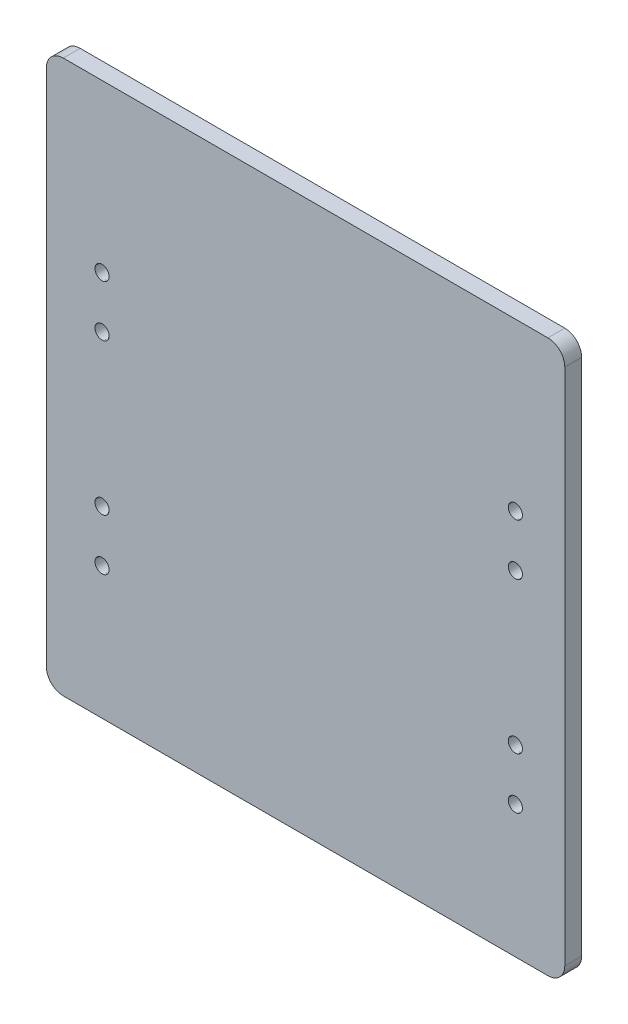
ISO-10303-21;
HEADER;
FILE_DESCRIPTION(('STEP AP214'),'2;1');
FILE_NAME('part.step','',(''),(''),'','','');
FILE_SCHEMA(('AUTOMOTIVE_DESIGN { 1 0 10303 214 1 1 1 1 }'));
ENDSEC;
DATA;
#1=APPLICATION_CONTEXT('core data for automotive mechanical design processes');
#2=APPLICATION_PROTOCOL_DEFINITION('international standard','automotive_design',2000,#1);
#3=PRODUCT_CONTEXT('',#1,'mechanical');
#4=PRODUCT('Part','Part','',(#3));
#5=PRODUCT_RELATED_PRODUCT_CATEGORY('part','',(#4));
#6=PRODUCT_DEFINITION_FORMATION('','',#4);
#7=PRODUCT_DEFINITION_CONTEXT('part definition',#1,'design');
#8=PRODUCT_DEFINITION('design','',#6,#7);
#9=PRODUCT_DEFINITION_SHAPE('','',#8);
#10=(LENGTH_UNIT() NAMED_UNIT(*) SI_UNIT(.MILLI.,.METRE.));
#11=(NAMED_UNIT(*) PLANE_ANGLE_UNIT() SI_UNIT($,.RADIAN.));
#12=(NAMED_UNIT(*) SI_UNIT($,.STERADIAN.) SOLID_ANGLE_UNIT());
#13=UNCERTAINTY_MEASURE_WITH_UNIT(LENGTH_MEASURE(1.E-05),#10,'distance_accuracy_value','');
#14=(GEOMETRIC_REPRESENTATION_CONTEXT(3) GLOBAL_UNCERTAINTY_ASSIGNED_CONTEXT((#13)) GLOBAL_UNIT_ASSIGNED_CONTEXT((#10,
#11,#12)) REPRESENTATION_CONTEXT('',''));
#15=CARTESIAN_POINT('',(0.,0.,0.));
#16=DIRECTION('',(0.,0.,1.));
#17=DIRECTION('',(1.,0.,0.));
#18=AXIS2_PLACEMENT_3D('',#15,#16,#17);
#19=CARTESIAN_POINT('',(-41.4092289645237,115.237241302709,-47.5914396525184));
#20=DIRECTION('',(4.37113957093474E-08,8.74227737145705E-08,0.999999999999995));
#21=DIRECTION('',(0.,-0.999999999999996,8.74227737145706E-08));
#22=AXIS2_PLACEMENT_3D('',#19,#20,#21);
#23=CYLINDRICAL_SURFACE('',#22,5.000115644616);
#24=CARTESIAN_POINT('',(-41.4092287459667,115.237241739823,-42.5914396525184));
#25=DIRECTION('',(-4.37113957093474E-08,-8.74227737145705E-08,-0.999999999999995));
#26=DIRECTION('',(0.,0.999999999999996,-8.74227737145706E-08));
#27=AXIS2_PLACEMENT_3D('',#24,#25,#26);
#28=CIRCLE('',#27,5.000115644616);
#29=CARTESIAN_POINT('',(-46.4093443905827,115.237242174719,-42.5914394339564));
#30=VERTEX_POINT('',#29);
#31=CARTESIAN_POINT('',(-41.4092283110702,120.237357384439,-42.5914400896424));
#32=VERTEX_POINT('',#31);
#33=EDGE_CURVE('E139',#30,#32,#28,.T.);
#34=ORIENTED_EDGE('',*,*,#33,.T.);
#35=DIRECTION('',(4.37113957093474E-08,8.74227737145705E-08,0.999999999999995));
#36=VECTOR('',#35,1.);
#37=CARTESIAN_POINT('',(-41.4092285296272,120.237356947325,-47.5914400896424));
#38=LINE('',#37,#36);
#39=CARTESIAN_POINT('',(-41.4092285296272,120.237356947325,-47.5914400896424));
#40=VERTEX_POINT('',#39);
#41=EDGE_CURVE('E11',#40,#32,#38,.T.);
#42=ORIENTED_EDGE('',*,*,#41,.F.);
#43=CARTESIAN_POINT('',(-41.4092289645237,115.237241302709,-47.5914396525184));
#44=DIRECTION('',(-4.37113957093474E-08,-8.74227737145705E-08,-0.999999999999995));
#45=DIRECTION('',(0.,0.999999999999996,-8.74227737145706E-08));
#46=AXIS2_PLACEMENT_3D('',#43,#44,#45);
#47=CIRCLE('',#46,5.000115644616);
#48=CARTESIAN_POINT('',(-46.4093446091397,115.237241737606,-47.5914394339564));
#49=VERTEX_POINT('',#48);
#50=EDGE_CURVE('E154',#49,#40,#47,.T.);
#51=ORIENTED_EDGE('',*,*,#50,.F.);
#52=DIRECTION('',(4.37113957093474E-08,8.74227737145705E-08,0.999999999999995));
#53=VECTOR('',#52,1.);
#54=CARTESIAN_POINT('',(-46.4093446091397,115.237241737606,-47.5914394339564));
#55=LINE('',#54,#53);
#56=EDGE_CURVE('E135',#49,#30,#55,.T.);
#57=ORIENTED_EDGE('',*,*,#56,.T.);
#58=EDGE_LOOP('',(#34,#42,#51,#57));
#59=FACE_BOUND('',#58,.T.);
#60=ADVANCED_FACE('F43',(#59),#23,.T.);
#61=CARTESIAN_POINT('',(-41.4092285296272,120.237356947325,-47.5914400896424));
#62=DIRECTION('',(-8.69772973691922E-08,-0.999999999999992,8.74227775164693E-08));
#63=DIRECTION('',(0.,-8.74227775164696E-08,-0.999999999999996));
#64=AXIS2_PLACEMENT_3D('',#61,#62,#63);
#65=PLANE('',#64);
#66=DIRECTION('',(0.999999999999995,-8.69773011905634E-08,-4.37113881053546E-08));
#67=VECTOR('',#66,1.);
#68=CARTESIAN_POINT('',(-41.4092283110702,120.237357384439,-42.5914400896424));
#69=LINE('',#68,#67);
#70=CARTESIAN_POINT('',(102.238540399693,120.237344890345,-42.5914463686858));
#71=VERTEX_POINT('',#70);
#72=EDGE_CURVE('E142',#32,#71,#69,.T.);
#73=ORIENTED_EDGE('',*,*,#72,.T.);
#74=DIRECTION('',(4.37113957093474E-08,8.74227737145705E-08,0.999999999999995));
#75=VECTOR('',#74,1.);
#76=CARTESIAN_POINT('',(102.238540181136,120.237344453231,-47.5914463686857));
#77=LINE('',#76,#75);
#78=CARTESIAN_POINT('',(102.238540181136,120.237344453231,-47.5914463686857));
#79=VERTEX_POINT('',#78);
#80=EDGE_CURVE('E51',#79,#71,#77,.T.);
#81=ORIENTED_EDGE('',*,*,#80,.F.);
#82=DIRECTION('',(0.999999999999995,-8.69773011905634E-08,-4.37113881053546E-08));
#83=VECTOR('',#82,1.);
#84=CARTESIAN_POINT('',(-41.4092285296272,120.237356947325,-47.5914400896424));
#85=LINE('',#84,#83);
#86=EDGE_CURVE('E102',#40,#79,#85,.T.);
#87=ORIENTED_EDGE('',*,*,#86,.F.);
#88=ORIENTED_EDGE('',*,*,#41,.T.);
#89=EDGE_LOOP('',(#73,#81,#87,#88));
#90=FACE_BOUND('',#89,.T.);
#91=ADVANCED_FACE('F236',(#90),#65,.F.);
#92=CARTESIAN_POINT('',(102.23853974624,115.237228808614,-47.5914459315617));
#93=DIRECTION('',(4.37113957093474E-08,8.74227737145705E-08,0.999999999999995));
#94=DIRECTION('',(0.,-0.999999999999996,8.74227737145706E-08));
#95=AXIS2_PLACEMENT_3D('',#92,#93,#94);
#96=CYLINDRICAL_SURFACE('',#95,5.00011564461702);
#97=CARTESIAN_POINT('',(102.238539964797,115.237229245728,-42.5914459315618));
#98=DIRECTION('',(-4.37113957093474E-08,-8.74227737145705E-08,-0.999999999999995));
#99=DIRECTION('',(0.,0.999999999999996,-8.74227737145706E-08));
#100=AXIS2_PLACEMENT_3D('',#97,#98,#99);
#101=CIRCLE('',#100,5.00011564461702);
#102=CARTESIAN_POINT('',(107.238655609415,115.237228810831,-42.5914461501238));
#103=VERTEX_POINT('',#102);
#104=EDGE_CURVE('E145',#71,#103,#101,.T.);
#105=ORIENTED_EDGE('',*,*,#104,.T.);
#106=DIRECTION('',(4.37113957093474E-08,8.74227737145705E-08,0.999999999999995));
#107=VECTOR('',#106,1.);
#108=CARTESIAN_POINT('',(107.238655390858,115.237228373717,-47.5914461501237));
#109=LINE('',#108,#107);
#110=CARTESIAN_POINT('',(107.238655390858,115.237228373717,-47.5914461501237));
#111=VERTEX_POINT('',#110);
#112=EDGE_CURVE('E161',#111,#103,#109,.T.);
#113=ORIENTED_EDGE('',*,*,#112,.F.);
#114=CARTESIAN_POINT('',(102.23853974624,115.237228808614,-47.5914459315617));
#115=DIRECTION('',(-4.37113957093474E-08,-8.74227737145705E-08,-0.999999999999995));
#116=DIRECTION('',(0.,0.999999999999996,-8.74227737145706E-08));
#117=AXIS2_PLACEMENT_3D('',#114,#115,#116);
#118=CIRCLE('',#117,5.00011564461702);
#119=EDGE_CURVE('E169',#79,#111,#118,.T.);
#120=ORIENTED_EDGE('',*,*,#119,.F.);
#121=ORIENTED_EDGE('',*,*,#80,.T.);
#122=EDGE_LOOP('',(#105,#113,#120,#121));
#123=FACE_BOUND('',#122,.T.);
#124=ADVANCED_FACE('F167',(#123),#96,.T.);
#125=CARTESIAN_POINT('',(107.238655390858,115.237228373717,-47.5914461501237));
#126=DIRECTION('',(-0.999999999999995,8.69772883903849E-08,4.37113881055516E-08));
#127=DIRECTION('',(-8.69772883903849E-08,-0.999999999999996,0.));
#128=AXIS2_PLACEMENT_3D('',#125,#126,#127);
#129=PLANE('',#128);
#130=DIRECTION('',(-8.69772845690136E-08,-0.999999999999992,8.74227775053595E-08));
#131=VECTOR('',#130,1.);
#132=CARTESIAN_POINT('',(107.238655609415,115.237228810831,-42.5914461501238));
#133=LINE('',#132,#131);
#134=CARTESIAN_POINT('',(107.238642239138,-38.4842462781418,-42.5914327113654));
#135=VERTEX_POINT('',#134);
#136=EDGE_CURVE('E147',#103,#135,#133,.T.);
#137=ORIENTED_EDGE('',*,*,#136,.T.);
#138=DIRECTION('',(4.37113957093474E-08,8.74227737145705E-08,0.999999999999995));
#139=VECTOR('',#138,1.);
#140=CARTESIAN_POINT('',(107.238642020581,-38.4842467152556,-47.5914327113654));
#141=LINE('',#140,#139);
#142=CARTESIAN_POINT('',(107.238642020581,-38.4842467152556,-47.5914327113654));
#143=VERTEX_POINT('',#142);
#144=EDGE_CURVE('E158',#143,#135,#141,.T.);
#145=ORIENTED_EDGE('',*,*,#144,.F.);
#146=DIRECTION('',(-8.69772845690136E-08,-0.999999999999992,8.74227775053595E-08));
#147=VECTOR('',#146,1.);
#148=CARTESIAN_POINT('',(107.238655390858,115.237228373717,-47.5914461501237));
#149=LINE('',#148,#147);
#150=EDGE_CURVE('E181',#111,#143,#149,.T.);
#151=ORIENTED_EDGE('',*,*,#150,.F.);
#152=ORIENTED_EDGE('',*,*,#112,.T.);
#153=EDGE_LOOP('',(#137,#145,#151,#152));
#154=FACE_BOUND('',#153,.T.);
#155=ADVANCED_FACE('F177',(#154),#129,.F.);
#156=CARTESIAN_POINT('',(102.240232754171,-38.4842462805075,-47.591432492878));
#157=DIRECTION('',(4.37113957093474E-08,8.74227737145705E-08,0.999999999999995));
#158=DIRECTION('',(0.,-0.999999999999996,8.74227737145706E-08));
#159=AXIS2_PLACEMENT_3D('',#156,#157,#158);
#160=CYLINDRICAL_SURFACE('',#159,4.99840926641003);
#161=CARTESIAN_POINT('',(102.240232972728,-38.4842458433937,-42.591432492878));
#162=DIRECTION('',(-4.37113957093474E-08,-8.74227737145705E-08,-0.999999999999995));
#163=DIRECTION('',(0.,0.999999999999996,-8.74227737145706E-08));
#164=AXIS2_PLACEMENT_3D('',#161,#162,#163);
#165=CIRCLE('',#164,4.99840926641003);
#166=CARTESIAN_POINT('',(102.24023253798,-43.4826551098037,-42.5914320559032));
#167=VERTEX_POINT('',#166);
#168=EDGE_CURVE('E149',#135,#167,#165,.T.);
#169=ORIENTED_EDGE('',*,*,#168,.T.);
#170=DIRECTION('',(4.37113957093474E-08,8.74227737145705E-08,0.999999999999995));
#171=VECTOR('',#170,1.);
#172=CARTESIAN_POINT('',(102.240232319423,-43.4826555469175,-47.5914320559032));
#173=LINE('',#172,#171);
#174=CARTESIAN_POINT('',(102.240232319423,-43.4826555469175,-47.5914320559032));
#175=VERTEX_POINT('',#174);
#176=EDGE_CURVE('E130',#175,#167,#173,.T.);
#177=ORIENTED_EDGE('',*,*,#176,.F.);
#178=CARTESIAN_POINT('',(102.240232754171,-38.4842462805075,-47.591432492878));
#179=DIRECTION('',(-4.37113957093474E-08,-8.74227737145705E-08,-0.999999999999995));
#180=DIRECTION('',(0.,0.999999999999996,-8.74227737145706E-08));
#181=AXIS2_PLACEMENT_3D('',#178,#179,#180);
#182=CIRCLE('',#181,4.99840926641003);
#183=EDGE_CURVE('E121',#143,#175,#182,.T.);
#184=ORIENTED_EDGE('',*,*,#183,.F.);
#185=ORIENTED_EDGE('',*,*,#144,.T.);
#186=EDGE_LOOP('',(#169,#177,#184,#185));
#187=FACE_BOUND('',#186,.T.);
#188=ADVANCED_FACE('F180',(#187),#160,.T.);
#189=CARTESIAN_POINT('',(102.240232319423,-43.4826555469175,-47.5914320559032));
#190=DIRECTION('',(8.69772974634374E-08,0.999999999999992,-8.74227775164693E-08));
#191=DIRECTION('',(0.,8.74227775164696E-08,0.999999999999996));
#192=AXIS2_PLACEMENT_3D('',#189,#190,#191);
#193=PLANE('',#192);
#194=DIRECTION('',(-0.999999999999995,8.69773012848086E-08,4.37113880776549E-08));
#195=VECTOR('',#194,1.);
#196=CARTESIAN_POINT('',(102.24023253798,-43.4826551098037,-42.5914320559032));
#197=LINE('',#196,#195);
#198=CARTESIAN_POINT('',(-41.4109489292004,-43.4826426154113,-42.5914257767107));
#199=VERTEX_POINT('',#198);
#200=EDGE_CURVE('E129',#167,#199,#197,.T.);
#201=ORIENTED_EDGE('',*,*,#200,.T.);
#202=DIRECTION('',(4.37113957093474E-08,8.74227737145705E-08,0.999999999999995));
#203=VECTOR('',#202,1.);
#204=CARTESIAN_POINT('',(-41.4109491477573,-43.4826430525252,-47.5914257767106));
#205=LINE('',#204,#203);
#206=CARTESIAN_POINT('',(-41.4109491477573,-43.4826430525252,-47.5914257767106));
#207=VERTEX_POINT('',#206);
#208=EDGE_CURVE('E126',#207,#199,#205,.T.);
#209=ORIENTED_EDGE('',*,*,#208,.F.);
#210=DIRECTION('',(-0.999999999999995,8.69773012848086E-08,4.37113880776549E-08));
#211=VECTOR('',#210,1.);
#212=CARTESIAN_POINT('',(102.240232319423,-43.4826555469175,-47.5914320559032));
#213=LINE('',#212,#211);
#214=EDGE_CURVE('E115',#175,#207,#213,.T.);
#215=ORIENTED_EDGE('',*,*,#214,.F.);
#216=ORIENTED_EDGE('',*,*,#176,.T.);
#217=EDGE_LOOP('',(#201,#209,#215,#216));
#218=FACE_BOUND('',#217,.T.);
#219=ADVANCED_FACE('F127',(#218),#193,.F.);
#220=CARTESIAN_POINT('',(-41.4109487130092,-38.4842337861155,-47.5914262136855));
#221=DIRECTION('',(4.37113957093474E-08,8.74227737145705E-08,0.999999999999995));
#222=DIRECTION('',(0.,-0.999999999999996,8.74227737145706E-08));
#223=AXIS2_PLACEMENT_3D('',#220,#221,#222);
#224=CYLINDRICAL_SURFACE('',#223,4.99840926640978);
#225=CARTESIAN_POINT('',(-41.4109484944522,-38.4842333490016,-42.5914262136855));
#226=DIRECTION('',(-4.37113957093474E-08,-8.74227737145705E-08,-0.999999999999995));
#227=DIRECTION('',(0.,0.999999999999996,-8.74227737145706E-08));
#228=AXIS2_PLACEMENT_3D('',#225,#226,#227);
#229=CIRCLE('',#228,4.99840926640978);
#230=CARTESIAN_POINT('',(-46.4093577608617,-38.4842329142534,-42.5914259951981));
#231=VERTEX_POINT('',#230);
#232=EDGE_CURVE('E88',#199,#231,#229,.T.);
#233=ORIENTED_EDGE('',*,*,#232,.T.);
#234=DIRECTION('',(4.37113957093474E-08,8.74227737145705E-08,0.999999999999995));
#235=VECTOR('',#234,1.);
#236=CARTESIAN_POINT('',(-46.4093579794187,-38.4842333513673,-47.5914259951981));
#237=LINE('',#236,#235);
#238=CARTESIAN_POINT('',(-46.4093579794187,-38.4842333513673,-47.5914259951981));
#239=VERTEX_POINT('',#238);
#240=EDGE_CURVE('E131',#239,#231,#237,.T.);
#241=ORIENTED_EDGE('',*,*,#240,.F.);
#242=CARTESIAN_POINT('',(-41.4109487130092,-38.4842337861155,-47.5914262136855));
#243=DIRECTION('',(-4.37113957093474E-08,-8.74227737145705E-08,-0.999999999999995));
#244=DIRECTION('',(0.,0.999999999999996,-8.74227737145706E-08));
#245=AXIS2_PLACEMENT_3D('',#242,#243,#244);
#246=CIRCLE('',#245,4.99840926640978);
#247=EDGE_CURVE('E119',#207,#239,#246,.T.);
#248=ORIENTED_EDGE('',*,*,#247,.F.);
#249=ORIENTED_EDGE('',*,*,#208,.T.);
#250=EDGE_LOOP('',(#233,#241,#248,#249));
#251=FACE_BOUND('',#250,.T.);
#252=ADVANCED_FACE('F133',(#251),#224,.T.);
#253=CARTESIAN_POINT('',(-46.4093579794187,-38.4842333513673,-47.5914259951981));
#254=DIRECTION('',(0.999999999999995,-8.69773047308447E-08,-4.37113881055502E-08));
#255=DIRECTION('',(8.69773047308448E-08,0.999999999999996,0.));
#256=AXIS2_PLACEMENT_3D('',#253,#254,#255);
#257=PLANE('',#256);
#258=DIRECTION('',(8.69773009094735E-08,0.999999999999992,-8.74227775053595E-08));
#259=VECTOR('',#258,1.);
#260=CARTESIAN_POINT('',(-46.4093577608617,-38.4842329142534,-42.5914259951981));
#261=LINE('',#260,#259);
#262=EDGE_CURVE('E94',#231,#30,#261,.T.);
#263=ORIENTED_EDGE('',*,*,#262,.T.);
#264=ORIENTED_EDGE('',*,*,#56,.F.);
#265=DIRECTION('',(8.69773009094735E-08,0.999999999999992,-8.74227775053595E-08));
#266=VECTOR('',#265,1.);
#267=CARTESIAN_POINT('',(-46.4093579794187,-38.4842333513673,-47.5914259951981));
#268=LINE('',#267,#266);
#269=EDGE_CURVE('E59',#239,#49,#268,.T.);
#270=ORIENTED_EDGE('',*,*,#269,.F.);
#271=ORIENTED_EDGE('',*,*,#240,.T.);
#272=EDGE_LOOP('',(#263,#264,#270,#271));
#273=FACE_BOUND('',#272,.T.);
#274=ADVANCED_FACE('F220',(#273),#257,.F.);
#275=CARTESIAN_POINT('',(-41.4092289645237,115.237241302709,-47.5914396525184));
#276=DIRECTION('',(-4.37113957093474E-08,-8.74227737145705E-08,-0.999999999999995));
#277=DIRECTION('',(0.,0.999999999999996,-8.74227737145706E-08));
#278=AXIS2_PLACEMENT_3D('',#275,#276,#277);
#279=PLANE('',#278);
#280=CARTESIAN_POINT('',(-30.8753805392917,72.8037823323235,-47.5914364033169));
#281=CARTESIAN_POINT('',(-31.042360648593,72.7171378795067,-47.5914363884433));
#282=CARTESIAN_POINT('',(-31.3568475674831,72.5063202734343,-47.5914363562664));
#283=CARTESIAN_POINT('',(-31.8391660268237,71.9025882012472,-47.5914362824036));
#284=CARTESIAN_POINT('',(-32.0885189047453,70.9872531793457,-47.5914361914829));
#285=CARTESIAN_POINT('',(-31.8549575819944,69.9296099612356,-47.5914361092301));
#286=CARTESIAN_POINT('',(-31.1246609544009,69.1297181535359,-47.5914360712236));
#287=CARTESIAN_POINT('',(-30.2326891859692,68.8066060609609,-47.5914360819656));
#288=CARTESIAN_POINT('',(-29.4613681894507,68.8533760463964,-47.5914361197699));
#289=CARTESIAN_POINT('',(-28.9312179119782,69.0570163541889,-47.5914361607463));
#290=CARTESIAN_POINT('',(-28.459487533643,69.3732427632976,-47.5914362090117));
#291=CARTESIAN_POINT('',(-27.9771690743024,69.9769748354846,-47.5914362828744));
#292=CARTESIAN_POINT('',(-27.7278161963808,70.8923098573862,-47.5914363737951));
#293=CARTESIAN_POINT('',(-27.9613775191317,71.9499530754963,-47.5914364560479));
#294=CARTESIAN_POINT('',(-28.6916741467252,72.7498448831959,-47.5914364940544));
#295=CARTESIAN_POINT('',(-29.5836459151569,73.0729569757709,-47.5914364833124));
#296=CARTESIAN_POINT('',(-30.3549669116754,73.0261869903354,-47.5914364455082));
#297=CARTESIAN_POINT('',(-30.7084004299904,72.8904267851404,-47.5914364181906));
#298=CARTESIAN_POINT('',(-30.8753805392917,72.8037823323235,-47.5914364033169));
#299=B_SPLINE_CURVE_WITH_KNOTS('',3,(#280,#281,#282,#283,#284,#285,#286,#287,#288,#289,#290,
#291,#292,#293,#294,#295,#296,#297,#298),.UNSPECIFIED.,.T.,.F.,(4,1,1,1,1,1,1,1,1,1,1,1,1,1,1,1,
4),(0.,0.0625,0.125,0.1875,0.25,0.3125,0.375,0.4375,0.5,0.5625,0.625,0.6875,0.75,0.8125,0.875,
0.9375,1.),.UNSPECIFIED.);
#300=CARTESIAN_POINT('',(-30.8753805392917,72.8037823323235,-47.5914364033169));
#301=VERTEX_POINT('',#300);
#302=EDGE_CURVE('E379',#301,#301,#299,.T.);
#303=ORIENTED_EDGE('',*,*,#302,.T.);
#304=EDGE_LOOP('',(#303));
#305=FACE_BOUND('',#304,.T.);
#306=CARTESIAN_POINT('',(93.5590454381651,69.075770049689,-47.5914415166062));
#307=CARTESIAN_POINT('',(93.7260255474664,69.1624145025059,-47.5914415314798));
#308=CARTESIAN_POINT('',(94.0405124663566,69.3732321085783,-47.5914415636567));
#309=CARTESIAN_POINT('',(94.5228309256971,69.9769641807653,-47.5914416375195));
#310=CARTESIAN_POINT('',(94.7721838036188,70.8922992026668,-47.5914417284402));
#311=CARTESIAN_POINT('',(94.5386224808678,71.949942420777,-47.591441810693));
#312=CARTESIAN_POINT('',(93.8083258532743,72.7498342284766,-47.5914418486995));
#313=CARTESIAN_POINT('',(92.9163540848426,73.0729463210516,-47.5914418379575));
#314=CARTESIAN_POINT('',(92.1450330883241,73.0261763356161,-47.5914418001532));
#315=CARTESIAN_POINT('',(91.6148828108516,72.8225360278235,-47.5914417591768));
#316=CARTESIAN_POINT('',(91.1431524325164,72.506309618715,-47.5914417109114));
#317=CARTESIAN_POINT('',(90.6608339731758,71.9025775465279,-47.5914416370487));
#318=CARTESIAN_POINT('',(90.4114810952542,70.9872425246264,-47.591441546128));
#319=CARTESIAN_POINT('',(90.645042418005,69.9295993065163,-47.5914414638752));
#320=CARTESIAN_POINT('',(91.3753390455986,69.1297074988166,-47.5914414258687));
#321=CARTESIAN_POINT('',(92.2673108140303,68.8065954062416,-47.5914414366107));
#322=CARTESIAN_POINT('',(93.0386318105488,68.8533653916771,-47.5914414744149));
#323=CARTESIAN_POINT('',(93.3920653288638,68.9891255968721,-47.5914415017325));
#324=CARTESIAN_POINT('',(93.5590454381651,69.075770049689,-47.5914415166062));
#325=B_SPLINE_CURVE_WITH_KNOTS('',3,(#306,#307,#308,#309,#310,#311,#312,#313,#314,#315,#316,
#317,#318,#319,#320,#321,#322,#323,#324),.UNSPECIFIED.,.T.,.F.,(4,1,1,1,1,1,1,1,1,1,1,1,1,1,1,1,
4),(0.,0.0625,0.125,0.1875,0.25,0.3125,0.375,0.4375,0.5,0.5625,0.625,0.6875,0.75,0.8125,0.875,
0.9375,1.),.UNSPECIFIED.);
#326=CARTESIAN_POINT('',(93.5590454381651,69.075770049689,-47.5914415166062));
#327=VERTEX_POINT('',#326);
#328=EDGE_CURVE('E395',#327,#327,#325,.T.);
#329=ORIENTED_EDGE('',*,*,#328,.T.);
#330=EDGE_LOOP('',(#329));
#331=FACE_BOUND('',#330,.T.);
#332=CARTESIAN_POINT('',(93.5590441117613,53.8257700496892,-47.5914401834088));
#333=CARTESIAN_POINT('',(93.7260242210626,53.912414502506,-47.5914401982825));
#334=CARTESIAN_POINT('',(94.0405111399528,54.1232321085784,-47.5914402304594));
#335=CARTESIAN_POINT('',(94.5228295992933,54.7269641807654,-47.5914403043221));
#336=CARTESIAN_POINT('',(94.772182477215,55.642299202667,-47.5914403952428));
#337=CARTESIAN_POINT('',(94.538621154464,56.6999424207771,-47.5914404774956));
#338=CARTESIAN_POINT('',(93.8083245268706,57.4998342284768,-47.5914405155021));
#339=CARTESIAN_POINT('',(92.9163527584387,57.8229463210518,-47.5914405047601));
#340=CARTESIAN_POINT('',(92.1450317619203,57.7761763356163,-47.5914404669558));
#341=CARTESIAN_POINT('',(91.6148814844478,57.5725360278237,-47.5914404259794));
#342=CARTESIAN_POINT('',(91.1431511061126,57.2563096187152,-47.5914403777141));
#343=CARTESIAN_POINT('',(90.6608326467721,56.6525775465281,-47.5914403038513));
#344=CARTESIAN_POINT('',(90.4114797688504,55.7372425246265,-47.5914402129306));
#345=CARTESIAN_POINT('',(90.6450410916013,54.6795993065164,-47.5914401306778));
#346=CARTESIAN_POINT('',(91.3753377191948,53.8797074988168,-47.5914400926713));
#347=CARTESIAN_POINT('',(92.2673094876266,53.5565954062418,-47.5914401034133));
#348=CARTESIAN_POINT('',(93.0386304841451,53.6033653916773,-47.5914401412176));
#349=CARTESIAN_POINT('',(93.39206400246,53.7391255968723,-47.5914401685352));
#350=CARTESIAN_POINT('',(93.5590441117613,53.8257700496892,-47.5914401834088));
#351=B_SPLINE_CURVE_WITH_KNOTS('',3,(#332,#333,#334,#335,#336,#337,#338,#339,#340,#341,#342,
#343,#344,#345,#346,#347,#348,#349,#350),.UNSPECIFIED.,.T.,.F.,(4,1,1,1,1,1,1,1,1,1,1,1,1,1,1,1,
4),(0.,0.0625,0.125,0.1875,0.25,0.3125,0.375,0.4375,0.5,0.5625,0.625,0.6875,0.75,0.8125,0.875,
0.9375,1.),.UNSPECIFIED.);
#352=CARTESIAN_POINT('',(93.5590441117613,53.8257700496892,-47.5914401834088));
#353=VERTEX_POINT('',#352);
#354=EDGE_CURVE('E412',#353,#353,#351,.T.);
#355=ORIENTED_EDGE('',*,*,#354,.T.);
#356=EDGE_LOOP('',(#355));
#357=FACE_BOUND('',#356,.T.);
#358=CARTESIAN_POINT('',(93.5590402195273,9.0757700496895,-47.5914362712395));
#359=CARTESIAN_POINT('',(93.7260203288286,9.16241450250635,-47.5914362861132));
#360=CARTESIAN_POINT('',(94.0405072477188,9.37323210857875,-47.5914363182901));
#361=CARTESIAN_POINT('',(94.5228257070593,9.97696418076576,-47.5914363921528));
#362=CARTESIAN_POINT('',(94.7721785849809,10.8922992026674,-47.5914364830735));
#363=CARTESIAN_POINT('',(94.5386172622301,11.9499424207775,-47.5914365653263));
#364=CARTESIAN_POINT('',(93.8083206346365,12.7498342284771,-47.5914366033328));
#365=CARTESIAN_POINT('',(92.9163488662048,13.0729463210521,-47.5914365925908));
#366=CARTESIAN_POINT('',(92.1450278696863,13.0261763356166,-47.5914365547866));
#367=CARTESIAN_POINT('',(91.6148775922138,12.8225360278241,-47.5914365138101));
#368=CARTESIAN_POINT('',(91.1431472138786,12.5063096187155,-47.5914364655448));
#369=CARTESIAN_POINT('',(90.660828754538,11.9025775465285,-47.591436391682));
#370=CARTESIAN_POINT('',(90.4114758766164,10.9872425246269,-47.5914363007613));
#371=CARTESIAN_POINT('',(90.6450371993673,9.92959930651674,-47.5914362185085));
#372=CARTESIAN_POINT('',(91.3753338269609,9.12970749881712,-47.591436180502));
#373=CARTESIAN_POINT('',(92.2673055953925,8.80659540624209,-47.591436191244));
#374=CARTESIAN_POINT('',(93.0386265919111,8.85336539167762,-47.5914362290483));
#375=CARTESIAN_POINT('',(93.392060110226,8.98912559687264,-47.5914362563659));
#376=CARTESIAN_POINT('',(93.5590402195273,9.0757700496895,-47.5914362712395));
#377=B_SPLINE_CURVE_WITH_KNOTS('',3,(#358,#359,#360,#361,#362,#363,#364,#365,#366,#367,#368,
#369,#370,#371,#372,#373,#374,#375,#376),.UNSPECIFIED.,.T.,.F.,(4,1,1,1,1,1,1,1,1,1,1,1,1,1,1,1,
4),(0.,0.0625,0.125,0.1875,0.25,0.3125,0.375,0.4375,0.5,0.5625,0.625,0.6875,0.75,0.8125,0.875,
0.9375,1.),.UNSPECIFIED.);
#378=CARTESIAN_POINT('',(93.5590402195273,9.0757700496895,-47.5914362712395));
#379=VERTEX_POINT('',#378);
#380=EDGE_CURVE('E201',#379,#379,#377,.T.);
#381=ORIENTED_EDGE('',*,*,#380,.T.);
#382=EDGE_LOOP('',(#381));
#383=FACE_BOUND('',#382,.T.);
#384=CARTESIAN_POINT('',(-30.8753870843332,-2.44621766767583,-47.5914298247529));
#385=CARTESIAN_POINT('',(-31.0423671936345,-2.53286212049269,-47.5914298098793));
#386=CARTESIAN_POINT('',(-31.3568541125246,-2.74367972656508,-47.5914297777024));
#387=CARTESIAN_POINT('',(-31.8391725718652,-3.3474117987521,-47.5914297038396));
#388=CARTESIAN_POINT('',(-32.0885254497868,-4.2627468206537,-47.5914296129189));
#389=CARTESIAN_POINT('',(-31.854964127036,-5.32039003876382,-47.5914295306661));
#390=CARTESIAN_POINT('',(-31.1246674994424,-6.12028184646344,-47.5914294926596));
#391=CARTESIAN_POINT('',(-30.2326957310107,-6.44339393903847,-47.5914295034016));
#392=CARTESIAN_POINT('',(-29.4613747344922,-6.39662395360293,-47.5914295412059));
#393=CARTESIAN_POINT('',(-28.9312244570197,-6.1929836458104,-47.5914295821823));
#394=CARTESIAN_POINT('',(-28.4594940786845,-5.87675723670181,-47.5914296304477));
#395=CARTESIAN_POINT('',(-27.9771756193439,-5.27302516451479,-47.5914297043104));
#396=CARTESIAN_POINT('',(-27.7278227414223,-4.3576901426132,-47.5914297952311));
#397=CARTESIAN_POINT('',(-27.9613840641732,-3.30004692450308,-47.5914298774839));
#398=CARTESIAN_POINT('',(-28.6916806917667,-2.50015511680346,-47.5914299154904));
#399=CARTESIAN_POINT('',(-29.5836524601984,-2.17704302422842,-47.5914299047484));
#400=CARTESIAN_POINT('',(-30.3549734567169,-2.22381300966396,-47.5914298669442));
#401=CARTESIAN_POINT('',(-30.7084069750319,-2.35957321485898,-47.5914298396265));
#402=CARTESIAN_POINT('',(-30.8753870843332,-2.44621766767583,-47.5914298247529));
#403=B_SPLINE_CURVE_WITH_KNOTS('',3,(#384,#385,#386,#387,#388,#389,#390,#391,#392,#393,#394,
#395,#396,#397,#398,#399,#400,#401,#402),.UNSPECIFIED.,.T.,.F.,(4,1,1,1,1,1,1,1,1,1,1,1,1,1,1,1,
4),(0.,0.0625,0.125,0.1875,0.25,0.3125,0.375,0.4375,0.5,0.5625,0.625,0.6875,0.75,0.8125,0.875,
0.9375,1.),.UNSPECIFIED.);
#404=CARTESIAN_POINT('',(-30.8753870843332,-2.44621766767583,-47.5914298247529));
#405=VERTEX_POINT('',#404);
#406=EDGE_CURVE('E447',#405,#405,#403,.T.);
#407=ORIENTED_EDGE('',*,*,#406,.T.);
#408=EDGE_LOOP('',(#407));
#409=FACE_BOUND('',#408,.T.);
#410=CARTESIAN_POINT('',(-30.8753857579294,12.803782332324,-47.5914311579503));
#411=CARTESIAN_POINT('',(-31.0423658672307,12.7171378795072,-47.5914311430766));
#412=CARTESIAN_POINT('',(-31.3568527861209,12.5063202734348,-47.5914311108997));
#413=CARTESIAN_POINT('',(-31.8391712454614,11.9025882012478,-47.591431037037));
#414=CARTESIAN_POINT('',(-32.0885241233831,10.9872531793462,-47.5914309461163));
#415=CARTESIAN_POINT('',(-31.8549628006322,9.92960996123604,-47.5914308638635));
#416=CARTESIAN_POINT('',(-31.1246661730386,9.12971815353642,-47.591430825857));
#417=CARTESIAN_POINT('',(-30.2326944046069,8.8066060609614,-47.591430836599));
#418=CARTESIAN_POINT('',(-29.4613734080884,8.85337604639693,-47.5914308744033));
#419=CARTESIAN_POINT('',(-28.931223130616,9.05701635418946,-47.5914309153797));
#420=CARTESIAN_POINT('',(-28.4594927522807,9.37324276329805,-47.591430963645));
#421=CARTESIAN_POINT('',(-27.9771742929402,9.97697483548507,-47.5914310375078));
#422=CARTESIAN_POINT('',(-27.7278214150185,10.8923098573867,-47.5914311284285));
#423=CARTESIAN_POINT('',(-27.9613827377694,11.9499530754968,-47.5914312106813));
#424=CARTESIAN_POINT('',(-28.691679365363,12.7498448831964,-47.5914312486878));
#425=CARTESIAN_POINT('',(-29.5836511337947,13.0729569757714,-47.5914312379458));
#426=CARTESIAN_POINT('',(-30.3549721303132,13.0261869903359,-47.5914312001415));
#427=CARTESIAN_POINT('',(-30.7084056486282,12.8904267851409,-47.5914311728239));
#428=CARTESIAN_POINT('',(-30.8753857579294,12.803782332324,-47.5914311579503));
#429=B_SPLINE_CURVE_WITH_KNOTS('',3,(#410,#411,#412,#413,#414,#415,#416,#417,#418,#419,#420,
#421,#422,#423,#424,#425,#426,#427,#428),.UNSPECIFIED.,.T.,.F.,(4,1,1,1,1,1,1,1,1,1,1,1,1,1,1,1,
4),(0.,0.0625,0.125,0.1875,0.25,0.3125,0.375,0.4375,0.5,0.5625,0.625,0.6875,0.75,0.8125,0.875,
0.9375,1.),.UNSPECIFIED.);
#430=CARTESIAN_POINT('',(-30.8753857579294,12.803782332324,-47.5914311579503));
#431=VERTEX_POINT('',#430);
#432=EDGE_CURVE('E465',#431,#431,#429,.T.);
#433=ORIENTED_EDGE('',*,*,#432,.T.);
#434=EDGE_LOOP('',(#433));
#435=FACE_BOUND('',#434,.T.);
#436=CARTESIAN_POINT('',(93.5590388931235,-6.17422995031036,-47.5914349380422));
#437=CARTESIAN_POINT('',(93.7260190024248,-6.08758549749351,-47.5914349529158));
#438=CARTESIAN_POINT('',(94.040505921315,-5.87676789142112,-47.5914349850927));
#439=CARTESIAN_POINT('',(94.5228243806555,-5.2730358192341,-47.5914350589555));
#440=CARTESIAN_POINT('',(94.7721772585772,-4.3577007973325,-47.5914351498762));
#441=CARTESIAN_POINT('',(94.5386159358263,-3.30005757922239,-47.591435232129));
#442=CARTESIAN_POINT('',(93.8083193082327,-2.50016577152277,-47.5914352701354));
#443=CARTESIAN_POINT('',(92.916347539801,-2.17705367894774,-47.5914352593935));
#444=CARTESIAN_POINT('',(92.1450265432825,-2.22382366438327,-47.5914352215892));
#445=CARTESIAN_POINT('',(91.6148762658101,-2.4274639721758,-47.5914351806128));
#446=CARTESIAN_POINT('',(91.1431458874748,-2.7436903812844,-47.5914351323474));
#447=CARTESIAN_POINT('',(90.6608274281343,-3.34742245347141,-47.5914350584847));
#448=CARTESIAN_POINT('',(90.4114745502126,-4.26275747537301,-47.591434967564));
#449=CARTESIAN_POINT('',(90.6450358729635,-5.32040069348312,-47.5914348853112));
#450=CARTESIAN_POINT('',(91.3753325005571,-6.12029250118274,-47.5914348473047));
#451=CARTESIAN_POINT('',(92.2673042689888,-6.44340459375777,-47.5914348580467));
#452=CARTESIAN_POINT('',(93.0386252655072,-6.39663460832224,-47.5914348958509));
#453=CARTESIAN_POINT('',(93.3920587838222,-6.26087440312721,-47.5914349231685));
#454=CARTESIAN_POINT('',(93.5590388931235,-6.17422995031036,-47.5914349380422));
#455=B_SPLINE_CURVE_WITH_KNOTS('',3,(#436,#437,#438,#439,#440,#441,#442,#443,#444,#445,#446,
#447,#448,#449,#450,#451,#452,#453,#454),.UNSPECIFIED.,.T.,.F.,(4,1,1,1,1,1,1,1,1,1,1,1,1,1,1,1,
4),(0.,0.0625,0.125,0.1875,0.25,0.3125,0.375,0.4375,0.5,0.5625,0.625,0.6875,0.75,0.8125,0.875,
0.9375,1.),.UNSPECIFIED.);
#456=CARTESIAN_POINT('',(93.5590388931235,-6.17422995031036,-47.5914349380422));
#457=VERTEX_POINT('',#456);
#458=EDGE_CURVE('E437',#457,#457,#455,.T.);
#459=ORIENTED_EDGE('',*,*,#458,.T.);
#460=EDGE_LOOP('',(#459));
#461=FACE_BOUND('',#460,.T.);
#462=CARTESIAN_POINT('',(-30.8753818656954,57.5537823323237,-47.5914350701196));
#463=CARTESIAN_POINT('',(-31.0423619749967,57.4671378795068,-47.5914350552459));
#464=CARTESIAN_POINT('',(-31.3568488938869,57.2563202734344,-47.591435023069));
#465=CARTESIAN_POINT('',(-31.8391673532274,56.6525882012474,-47.5914349492063));
#466=CARTESIAN_POINT('',(-32.0885202311491,55.7372531793458,-47.5914348582856));
#467=CARTESIAN_POINT('',(-31.8549589083982,54.6796099612357,-47.5914347760328));
#468=CARTESIAN_POINT('',(-31.1246622808046,53.8797181535361,-47.5914347380263));
#469=CARTESIAN_POINT('',(-30.2326905123729,53.5566060609611,-47.5914347487683));
#470=CARTESIAN_POINT('',(-29.4613695158545,53.6033760463966,-47.5914347865725));
#471=CARTESIAN_POINT('',(-28.931219238382,53.8070163541891,-47.5914348275489));
#472=CARTESIAN_POINT('',(-28.4594888600468,54.1232427632977,-47.5914348758143));
#473=CARTESIAN_POINT('',(-27.9771704007062,54.7269748354847,-47.5914349496771));
#474=CARTESIAN_POINT('',(-27.7278175227845,55.6423098573863,-47.5914350405978));
#475=CARTESIAN_POINT('',(-27.9613788455354,56.6999530754964,-47.5914351228506));
#476=CARTESIAN_POINT('',(-28.691675473129,57.4998448831961,-47.5914351608571));
#477=CARTESIAN_POINT('',(-29.5836472415607,57.8229569757711,-47.5914351501151));
#478=CARTESIAN_POINT('',(-30.3549682380792,57.7761869903356,-47.5914351123108));
#479=CARTESIAN_POINT('',(-30.7084017563942,57.6404267851405,-47.5914350849932));
#480=CARTESIAN_POINT('',(-30.8753818656954,57.5537823323237,-47.5914350701196));
#481=B_SPLINE_CURVE_WITH_KNOTS('',3,(#462,#463,#464,#465,#466,#467,#468,#469,#470,#471,#472,
#473,#474,#475,#476,#477,#478,#479,#480),.UNSPECIFIED.,.T.,.F.,(4,1,1,1,1,1,1,1,1,1,1,1,1,1,1,1,
4),(0.,0.0625,0.125,0.1875,0.25,0.3125,0.375,0.4375,0.5,0.5625,0.625,0.6875,0.75,0.8125,0.875,
0.9375,1.),.UNSPECIFIED.);
#482=CARTESIAN_POINT('',(-30.8753818656954,57.5537823323237,-47.5914350701196));
#483=VERTEX_POINT('',#482);
#484=EDGE_CURVE('E143',#483,#483,#481,.T.);
#485=ORIENTED_EDGE('',*,*,#484,.T.);
#486=EDGE_LOOP('',(#485));
#487=FACE_BOUND('',#486,.T.);
#488=ORIENTED_EDGE('',*,*,#50,.T.);
#489=ORIENTED_EDGE('',*,*,#86,.T.);
#490=ORIENTED_EDGE('',*,*,#119,.T.);
#491=ORIENTED_EDGE('',*,*,#150,.T.);
#492=ORIENTED_EDGE('',*,*,#183,.T.);
#493=ORIENTED_EDGE('',*,*,#214,.T.);
#494=ORIENTED_EDGE('',*,*,#247,.T.);
#495=ORIENTED_EDGE('',*,*,#269,.T.);
#496=EDGE_LOOP('',(#488,#489,#490,#491,#492,#493,#494,#495));
#497=FACE_BOUND('',#496,.T.);
#498=ADVANCED_FACE('F117',(#305,#331,#357,#383,#409,#435,#461,#487,#497),#279,.T.);
#499=CARTESIAN_POINT('',(-41.4092287459667,115.237241739823,-42.5914396525184));
#500=DIRECTION('',(-4.37113957093474E-08,-8.74227737145705E-08,-0.999999999999995));
#501=DIRECTION('',(0.,0.999999999999996,-8.74227737145706E-08));
#502=AXIS2_PLACEMENT_3D('',#499,#500,#501);
#503=PLANE('',#502);
#504=CARTESIAN_POINT('',(-30.8753803207347,72.8037827694374,-42.5914364033169));
#505=CARTESIAN_POINT('',(-31.042360430036,72.7171383166205,-42.5914363884433));
#506=CARTESIAN_POINT('',(-31.3568473489261,72.5063207105481,-42.5914363562664));
#507=CARTESIAN_POINT('',(-31.8391658082667,71.9025886383611,-42.5914362824036));
#508=CARTESIAN_POINT('',(-32.0885186861884,70.9872536164595,-42.591436191483));
#509=CARTESIAN_POINT('',(-31.8549573634375,69.9296103983495,-42.5914361092301));
#510=CARTESIAN_POINT('',(-31.1246607358439,69.1297185906498,-42.5914360712237));
#511=CARTESIAN_POINT('',(-30.2326889674122,68.8066064980748,-42.5914360819656));
#512=CARTESIAN_POINT('',(-29.4613679708937,68.8533764835103,-42.5914361197699));
#513=CARTESIAN_POINT('',(-28.9312176934212,69.0570167913028,-42.5914361607463));
#514=CARTESIAN_POINT('',(-28.459487315086,69.3732432004114,-42.5914362090117));
#515=CARTESIAN_POINT('',(-27.9771688557455,69.9769752725985,-42.5914362828745));
#516=CARTESIAN_POINT('',(-27.7278159778238,70.8923102945,-42.5914363737951));
#517=CARTESIAN_POINT('',(-27.9613773005747,71.9499535126102,-42.591436456048));
#518=CARTESIAN_POINT('',(-28.6916739281683,72.7498453203098,-42.5914364940544));
#519=CARTESIAN_POINT('',(-29.5836456966,73.0729574128848,-42.5914364833125));
#520=CARTESIAN_POINT('',(-30.3549666931184,73.0261874274492,-42.5914364455082));
#521=CARTESIAN_POINT('',(-30.7084002114334,72.8904272222542,-42.5914364181906));
#522=CARTESIAN_POINT('',(-30.8753803207347,72.8037827694374,-42.5914364033169));
#523=B_SPLINE_CURVE_WITH_KNOTS('',3,(#504,#505,#506,#507,#508,#509,#510,#511,#512,#513,#514,
#515,#516,#517,#518,#519,#520,#521,#522),.UNSPECIFIED.,.T.,.F.,(4,1,1,1,1,1,1,1,1,1,1,1,1,1,1,1,
4),(0.,0.0625,0.125,0.1875,0.25,0.3125,0.375,0.4375,0.5,0.5625,0.625,0.6875,0.75,0.8125,0.875,
0.9375,1.),.UNSPECIFIED.);
#524=CARTESIAN_POINT('',(-30.8753803207347,72.8037827694374,-42.5914364033169));
#525=VERTEX_POINT('',#524);
#526=EDGE_CURVE('E192',#525,#525,#523,.T.);
#527=ORIENTED_EDGE('',*,*,#526,.F.);
#528=EDGE_LOOP('',(#527));
#529=FACE_BOUND('',#528,.T.);
#530=CARTESIAN_POINT('',(93.559045656722,69.0757704868029,-42.5914415166062));
#531=CARTESIAN_POINT('',(93.7260257660233,69.1624149396197,-42.5914415314798));
#532=CARTESIAN_POINT('',(94.0405126849135,69.3732325456921,-42.5914415636568));
#533=CARTESIAN_POINT('',(94.522831144254,69.9769646178791,-42.5914416375195));
#534=CARTESIAN_POINT('',(94.7721840221757,70.8922996397807,-42.5914417284402));
#535=CARTESIAN_POINT('',(94.5386226994248,71.9499428578909,-42.591441810693));
#536=CARTESIAN_POINT('',(93.8083260718313,72.7498346655905,-42.5914418486995));
#537=CARTESIAN_POINT('',(92.9163543033996,73.0729467581655,-42.5914418379575));
#538=CARTESIAN_POINT('',(92.1450333068811,73.02617677273,-42.5914418001532));
#539=CARTESIAN_POINT('',(91.6148830294086,72.8225364649374,-42.5914417591768));
#540=CARTESIAN_POINT('',(91.1431526510734,72.5063100558289,-42.5914417109114));
#541=CARTESIAN_POINT('',(90.6608341917328,71.9025779836418,-42.5914416370487));
#542=CARTESIAN_POINT('',(90.4114813138112,70.9872429617403,-42.591441546128));
#543=CARTESIAN_POINT('',(90.645042636562,69.9295997436301,-42.5914414638752));
#544=CARTESIAN_POINT('',(91.3753392641556,69.1297079359305,-42.5914414258687));
#545=CARTESIAN_POINT('',(92.2673110325873,68.8065958433555,-42.5914414366107));
#546=CARTESIAN_POINT('',(93.0386320291058,68.853365828791,-42.591441474415));
#547=CARTESIAN_POINT('',(93.3920655474208,68.989126033986,-42.5914415017326));
#548=CARTESIAN_POINT('',(93.559045656722,69.0757704868029,-42.5914415166062));
#549=B_SPLINE_CURVE_WITH_KNOTS('',3,(#530,#531,#532,#533,#534,#535,#536,#537,#538,#539,#540,
#541,#542,#543,#544,#545,#546,#547,#548),.UNSPECIFIED.,.T.,.F.,(4,1,1,1,1,1,1,1,1,1,1,1,1,1,1,1,
4),(0.,0.0625,0.125,0.1875,0.25,0.3125,0.375,0.4375,0.5,0.5625,0.625,0.6875,0.75,0.8125,0.875,
0.9375,1.),.UNSPECIFIED.);
#550=CARTESIAN_POINT('',(93.559045656722,69.0757704868029,-42.5914415166062));
#551=VERTEX_POINT('',#550);
#552=EDGE_CURVE('E386',#551,#551,#549,.T.);
#553=ORIENTED_EDGE('',*,*,#552,.F.);
#554=EDGE_LOOP('',(#553));
#555=FACE_BOUND('',#554,.T.);
#556=CARTESIAN_POINT('',(93.5590443303183,53.825770486803,-42.5914401834088));
#557=CARTESIAN_POINT('',(93.7260244396196,53.9124149396199,-42.5914401982825));
#558=CARTESIAN_POINT('',(94.0405113585098,54.1232325456923,-42.5914402304594));
#559=CARTESIAN_POINT('',(94.5228298178502,54.7269646178793,-42.5914403043221));
#560=CARTESIAN_POINT('',(94.772182695772,55.6422996397809,-42.5914403952428));
#561=CARTESIAN_POINT('',(94.538621373021,56.699942857891,-42.5914404774956));
#562=CARTESIAN_POINT('',(93.8083247454275,57.4998346655907,-42.5914405155021));
#563=CARTESIAN_POINT('',(92.9163529769957,57.8229467581656,-42.5914405047601));
#564=CARTESIAN_POINT('',(92.1450319804773,57.7761767727301,-42.5914404669559));
#565=CARTESIAN_POINT('',(91.6148817030048,57.5725364649376,-42.5914404259795));
#566=CARTESIAN_POINT('',(91.1431513246696,57.256310055829,-42.5914403777141));
#567=CARTESIAN_POINT('',(90.660832865329,56.652577983642,-42.5914403038513));
#568=CARTESIAN_POINT('',(90.4114799874073,55.7372429617404,-42.5914402129306));
#569=CARTESIAN_POINT('',(90.6450413101583,54.6795997436303,-42.5914401306778));
#570=CARTESIAN_POINT('',(91.3753379377518,53.8797079359306,-42.5914400926713));
#571=CARTESIAN_POINT('',(92.2673097061835,53.5565958433556,-42.5914401034133));
#572=CARTESIAN_POINT('',(93.038630702702,53.6033658287912,-42.5914401412176));
#573=CARTESIAN_POINT('',(93.392064221017,53.7391260339862,-42.5914401685352));
#574=CARTESIAN_POINT('',(93.5590443303183,53.825770486803,-42.5914401834088));
#575=B_SPLINE_CURVE_WITH_KNOTS('',3,(#556,#557,#558,#559,#560,#561,#562,#563,#564,#565,#566,
#567,#568,#569,#570,#571,#572,#573,#574),.UNSPECIFIED.,.T.,.F.,(4,1,1,1,1,1,1,1,1,1,1,1,1,1,1,1,
4),(0.,0.0625,0.125,0.1875,0.25,0.3125,0.375,0.4375,0.5,0.5625,0.625,0.6875,0.75,0.8125,0.875,
0.9375,1.),.UNSPECIFIED.);
#576=CARTESIAN_POINT('',(93.5590443303183,53.825770486803,-42.5914401834088));
#577=VERTEX_POINT('',#576);
#578=EDGE_CURVE('E404',#577,#577,#575,.T.);
#579=ORIENTED_EDGE('',*,*,#578,.F.);
#580=EDGE_LOOP('',(#579));
#581=FACE_BOUND('',#580,.T.);
#582=CARTESIAN_POINT('',(93.5590404380843,9.07577048680337,-42.5914362712396));
#583=CARTESIAN_POINT('',(93.7260205473855,9.16241493962022,-42.5914362861132));
#584=CARTESIAN_POINT('',(94.0405074662757,9.37323254569262,-42.5914363182901));
#585=CARTESIAN_POINT('',(94.5228259256163,9.97696461787963,-42.5914363921529));
#586=CARTESIAN_POINT('',(94.7721788035379,10.8922996397812,-42.5914364830735));
#587=CARTESIAN_POINT('',(94.5386174807871,11.9499428578913,-42.5914365653264));
#588=CARTESIAN_POINT('',(93.8083208531935,12.749834665591,-42.5914366033328));
#589=CARTESIAN_POINT('',(92.9163490847618,13.072946758166,-42.5914365925909));
#590=CARTESIAN_POINT('',(92.1450280882433,13.0261767727305,-42.5914365547866));
#591=CARTESIAN_POINT('',(91.6148778107708,12.8225364649379,-42.5914365138102));
#592=CARTESIAN_POINT('',(91.1431474324356,12.5063100558293,-42.5914364655448));
#593=CARTESIAN_POINT('',(90.660828973095,11.9025779836423,-42.591436391682));
#594=CARTESIAN_POINT('',(90.4114760951734,10.9872429617407,-42.5914363007614));
#595=CARTESIAN_POINT('',(90.6450374179243,9.9295997436306,-42.5914362185085));
#596=CARTESIAN_POINT('',(91.3753340455178,9.12970793593099,-42.5914361805021));
#597=CARTESIAN_POINT('',(92.2673058139495,8.80659584335596,-42.591436191244));
#598=CARTESIAN_POINT('',(93.038626810468,8.85336582879149,-42.5914362290483));
#599=CARTESIAN_POINT('',(93.392060328783,8.98912603398651,-42.5914362563659));
#600=CARTESIAN_POINT('',(93.5590404380843,9.07577048680337,-42.5914362712396));
#601=B_SPLINE_CURVE_WITH_KNOTS('',3,(#582,#583,#584,#585,#586,#587,#588,#589,#590,#591,#592,
#593,#594,#595,#596,#597,#598,#599,#600),.UNSPECIFIED.,.T.,.F.,(4,1,1,1,1,1,1,1,1,1,1,1,1,1,1,1,
4),(0.,0.0625,0.125,0.1875,0.25,0.3125,0.375,0.4375,0.5,0.5625,0.625,0.6875,0.75,0.8125,0.875,
0.9375,1.),.UNSPECIFIED.);
#602=CARTESIAN_POINT('',(93.5590404380843,9.07577048680337,-42.5914362712396));
#603=VERTEX_POINT('',#602);
#604=EDGE_CURVE('E420',#603,#603,#601,.T.);
#605=ORIENTED_EDGE('',*,*,#604,.F.);
#606=EDGE_LOOP('',(#605));
#607=FACE_BOUND('',#606,.T.);
#608=CARTESIAN_POINT('',(-30.8753868657762,-2.44621723056196,-42.5914298247529));
#609=CARTESIAN_POINT('',(-31.0423669750775,-2.53286168337882,-42.5914298098793));
#610=CARTESIAN_POINT('',(-31.3568538939676,-2.74367928945121,-42.5914297777024));
#611=CARTESIAN_POINT('',(-31.8391723533082,-3.34741136163823,-42.5914297038396));
#612=CARTESIAN_POINT('',(-32.0885252312299,-4.26274638353983,-42.5914296129189));
#613=CARTESIAN_POINT('',(-31.854963908479,-5.32038960164995,-42.5914295306661));
#614=CARTESIAN_POINT('',(-31.1246672808854,-6.12028140934957,-42.5914294926597));
#615=CARTESIAN_POINT('',(-30.2326955124537,-6.4433935019246,-42.5914295034016));
#616=CARTESIAN_POINT('',(-29.4613745159352,-6.39662351648906,-42.5914295412059));
#617=CARTESIAN_POINT('',(-28.9312242384627,-6.19298320869653,-42.5914295821823));
#618=CARTESIAN_POINT('',(-28.4594938601275,-5.87675679958794,-42.5914296304477));
#619=CARTESIAN_POINT('',(-27.977175400787,-5.27302472740092,-42.5914297043104));
#620=CARTESIAN_POINT('',(-27.7278225228653,-4.35768970549933,-42.5914297952311));
#621=CARTESIAN_POINT('',(-27.9613838456162,-3.30004648738921,-42.591429877484));
#622=CARTESIAN_POINT('',(-28.6916804732098,-2.50015467968959,-42.5914299154904));
#623=CARTESIAN_POINT('',(-29.5836522416415,-2.17704258711456,-42.5914299047485));
#624=CARTESIAN_POINT('',(-30.3549732381599,-2.22381257255009,-42.5914298669442));
#625=CARTESIAN_POINT('',(-30.7084067564749,-2.35957277774511,-42.5914298396266));
#626=CARTESIAN_POINT('',(-30.8753868657762,-2.44621723056196,-42.5914298247529));
#627=B_SPLINE_CURVE_WITH_KNOTS('',3,(#608,#609,#610,#611,#612,#613,#614,#615,#616,#617,#618,
#619,#620,#621,#622,#623,#624,#625,#626),.UNSPECIFIED.,.T.,.F.,(4,1,1,1,1,1,1,1,1,1,1,1,1,1,1,1,
4),(0.,0.0625,0.125,0.1875,0.25,0.3125,0.375,0.4375,0.5,0.5625,0.625,0.6875,0.75,0.8125,0.875,
0.9375,1.),.UNSPECIFIED.);
#628=CARTESIAN_POINT('',(-30.8753868657762,-2.44621723056196,-42.5914298247529));
#629=VERTEX_POINT('',#628);
#630=EDGE_CURVE('E473',#629,#629,#627,.T.);
#631=ORIENTED_EDGE('',*,*,#630,.F.);
#632=EDGE_LOOP('',(#631));
#633=FACE_BOUND('',#632,.T.);
#634=CARTESIAN_POINT('',(-30.8753855393725,12.8037827694379,-42.5914311579503));
#635=CARTESIAN_POINT('',(-31.0423656486737,12.717138316621,-42.5914311430767));
#636=CARTESIAN_POINT('',(-31.3568525675639,12.5063207105487,-42.5914311108997));
#637=CARTESIAN_POINT('',(-31.8391710269044,11.9025886383616,-42.591431037037));
#638=CARTESIAN_POINT('',(-32.0885239048261,10.98725361646,-42.5914309461163));
#639=CARTESIAN_POINT('',(-31.8549625820752,9.92961039834991,-42.5914308638635));
#640=CARTESIAN_POINT('',(-31.1246659544817,9.12971859065029,-42.591430825857));
#641=CARTESIAN_POINT('',(-30.23269418605,8.80660649807526,-42.591430836599));
#642=CARTESIAN_POINT('',(-29.4613731895315,8.85337648351079,-42.5914308744033));
#643=CARTESIAN_POINT('',(-28.931222912059,9.05701679130333,-42.5914309153797));
#644=CARTESIAN_POINT('',(-28.4594925337238,9.37324320041192,-42.5914309636451));
#645=CARTESIAN_POINT('',(-27.9771740743832,9.97697527259893,-42.5914310375078));
#646=CARTESIAN_POINT('',(-27.7278211964616,10.8923102945005,-42.5914311284285));
#647=CARTESIAN_POINT('',(-27.9613825192124,11.9499535126106,-42.5914312106813));
#648=CARTESIAN_POINT('',(-28.691679146806,12.7498453203103,-42.5914312486878));
#649=CARTESIAN_POINT('',(-29.5836509152377,13.0729574128853,-42.5914312379458));
#650=CARTESIAN_POINT('',(-30.3549719117562,13.0261874274498,-42.5914312001415));
#651=CARTESIAN_POINT('',(-30.7084054300712,12.8904272222547,-42.5914311728239));
#652=CARTESIAN_POINT('',(-30.8753855393725,12.8037827694379,-42.5914311579503));
#653=B_SPLINE_CURVE_WITH_KNOTS('',3,(#634,#635,#636,#637,#638,#639,#640,#641,#642,#643,#644,
#645,#646,#647,#648,#649,#650,#651,#652),.UNSPECIFIED.,.T.,.F.,(4,1,1,1,1,1,1,1,1,1,1,1,1,1,1,1,
4),(0.,0.0625,0.125,0.1875,0.25,0.3125,0.375,0.4375,0.5,0.5625,0.625,0.6875,0.75,0.8125,0.875,
0.9375,1.),.UNSPECIFIED.);
#654=CARTESIAN_POINT('',(-30.8753855393725,12.8037827694379,-42.5914311579503));
#655=VERTEX_POINT('',#654);
#656=EDGE_CURVE('E442',#655,#655,#653,.T.);
#657=ORIENTED_EDGE('',*,*,#656,.F.);
#658=EDGE_LOOP('',(#657));
#659=FACE_BOUND('',#658,.T.);
#660=CARTESIAN_POINT('',(93.5590391116805,-6.17422951319649,-42.5914349380422));
#661=CARTESIAN_POINT('',(93.7260192209818,-6.08758506037964,-42.5914349529158));
#662=CARTESIAN_POINT('',(94.040506139872,-5.87676745430725,-42.5914349850927));
#663=CARTESIAN_POINT('',(94.5228245992125,-5.27303538212023,-42.5914350589555));
#664=CARTESIAN_POINT('',(94.7721774771342,-4.35770036021863,-42.5914351498762));
#665=CARTESIAN_POINT('',(94.5386161543833,-3.30005714210852,-42.591435232129));
#666=CARTESIAN_POINT('',(93.8083195267897,-2.5001653344089,-42.5914352701355));
#667=CARTESIAN_POINT('',(92.916347758358,-2.17705324183387,-42.5914352593935));
#668=CARTESIAN_POINT('',(92.1450267618395,-2.2238232272694,-42.5914352215892));
#669=CARTESIAN_POINT('',(91.614876484367,-2.42746353506193,-42.5914351806128));
#670=CARTESIAN_POINT('',(91.1431461060318,-2.74368994417053,-42.5914351323474));
#671=CARTESIAN_POINT('',(90.6608276466913,-3.34742201635754,-42.5914350584847));
#672=CARTESIAN_POINT('',(90.4114747687696,-4.26275703825914,-42.591434967564));
#673=CARTESIAN_POINT('',(90.6450360915205,-5.32040025636925,-42.5914348853112));
#674=CARTESIAN_POINT('',(91.375332719114,-6.12029206406887,-42.5914348473047));
#675=CARTESIAN_POINT('',(92.2673044875458,-6.4434041566439,-42.5914348580467));
#676=CARTESIAN_POINT('',(93.0386254840642,-6.39663417120837,-42.591434895851));
#677=CARTESIAN_POINT('',(93.3920590023792,-6.26087396601334,-42.5914349231686));
#678=CARTESIAN_POINT('',(93.5590391116805,-6.17422951319649,-42.5914349380422));
#679=B_SPLINE_CURVE_WITH_KNOTS('',3,(#660,#661,#662,#663,#664,#665,#666,#667,#668,#669,#670,
#671,#672,#673,#674,#675,#676,#677,#678),.UNSPECIFIED.,.T.,.F.,(4,1,1,1,1,1,1,1,1,1,1,1,1,1,1,1,
4),(0.,0.0625,0.125,0.1875,0.25,0.3125,0.375,0.4375,0.5,0.5625,0.625,0.6875,0.75,0.8125,0.875,
0.9375,1.),.UNSPECIFIED.);
#680=CARTESIAN_POINT('',(93.5590391116805,-6.17422951319649,-42.5914349380422));
#681=VERTEX_POINT('',#680);
#682=EDGE_CURVE('E433',#681,#681,#679,.T.);
#683=ORIENTED_EDGE('',*,*,#682,.F.);
#684=EDGE_LOOP('',(#683));
#685=FACE_BOUND('',#684,.T.);
#686=CARTESIAN_POINT('',(-30.8753816471385,57.5537827694375,-42.5914350701196));
#687=CARTESIAN_POINT('',(-31.0423617564397,57.4671383166207,-42.591435055246));
#688=CARTESIAN_POINT('',(-31.3568486753299,57.2563207105483,-42.591435023069));
#689=CARTESIAN_POINT('',(-31.8391671346704,56.6525886383613,-42.5914349492063));
#690=CARTESIAN_POINT('',(-32.0885200125921,55.7372536164597,-42.5914348582856));
#691=CARTESIAN_POINT('',(-31.8549586898412,54.6796103983496,-42.5914347760328));
#692=CARTESIAN_POINT('',(-31.1246620622477,53.8797185906499,-42.5914347380263));
#693=CARTESIAN_POINT('',(-30.232690293816,53.5566064980749,-42.5914347487683));
#694=CARTESIAN_POINT('',(-29.4613692972975,53.6033764835104,-42.5914347865726));
#695=CARTESIAN_POINT('',(-28.931219019825,53.807016791303,-42.591434827549));
#696=CARTESIAN_POINT('',(-28.4594886414898,54.1232432004116,-42.5914348758144));
#697=CARTESIAN_POINT('',(-27.9771701821492,54.7269752725986,-42.5914349496771));
#698=CARTESIAN_POINT('',(-27.7278173042275,55.6423102945002,-42.5914350405978));
#699=CARTESIAN_POINT('',(-27.9613786269785,56.6999535126103,-42.5914351228506));
#700=CARTESIAN_POINT('',(-28.691675254572,57.4998453203099,-42.5914351608571));
#701=CARTESIAN_POINT('',(-29.5836470230037,57.8229574128849,-42.5914351501151));
#702=CARTESIAN_POINT('',(-30.3549680195222,57.7761874274494,-42.5914351123108));
#703=CARTESIAN_POINT('',(-30.7084015378372,57.6404272222544,-42.5914350849932));
#704=CARTESIAN_POINT('',(-30.8753816471385,57.5537827694375,-42.5914350701196));
#705=B_SPLINE_CURVE_WITH_KNOTS('',3,(#686,#687,#688,#689,#690,#691,#692,#693,#694,#695,#696,
#697,#698,#699,#700,#701,#702,#703,#704),.UNSPECIFIED.,.T.,.F.,(4,1,1,1,1,1,1,1,1,1,1,1,1,1,1,1,
4),(0.,0.0625,0.125,0.1875,0.25,0.3125,0.375,0.4375,0.5,0.5625,0.625,0.6875,0.75,0.8125,0.875,
0.9375,1.),.UNSPECIFIED.);
#706=CARTESIAN_POINT('',(-30.8753816471385,57.5537827694375,-42.5914350701196));
#707=VERTEX_POINT('',#706);
#708=EDGE_CURVE('E187',#707,#707,#705,.T.);
#709=ORIENTED_EDGE('',*,*,#708,.F.);
#710=EDGE_LOOP('',(#709));
#711=FACE_BOUND('',#710,.T.);
#712=ORIENTED_EDGE('',*,*,#33,.F.);
#713=ORIENTED_EDGE('',*,*,#262,.F.);
#714=ORIENTED_EDGE('',*,*,#232,.F.);
#715=ORIENTED_EDGE('',*,*,#200,.F.);
#716=ORIENTED_EDGE('',*,*,#168,.F.);
#717=ORIENTED_EDGE('',*,*,#136,.F.);
#718=ORIENTED_EDGE('',*,*,#104,.F.);
#719=ORIENTED_EDGE('',*,*,#72,.F.);
#720=EDGE_LOOP('',(#712,#713,#714,#715,#716,#717,#718,#719));
#721=FACE_BOUND('',#720,.T.);
#722=ADVANCED_FACE('F173',(#529,#555,#581,#607,#633,#659,#685,#711,#721),#503,.F.);
#723=DIRECTION('',(4.37113957093474E-08,8.74227737145705E-08,0.999999999999995));
#724=VECTOR('',#723,1.);
#725=SURFACE_OF_LINEAR_EXTRUSION('',#481,#724);
#726=ORIENTED_EDGE('',*,*,#484,.F.);
#727=EDGE_LOOP('',(#726));
#728=FACE_BOUND('',#727,.T.);
#729=ORIENTED_EDGE('',*,*,#708,.T.);
#730=EDGE_LOOP('',(#729));
#731=FACE_BOUND('',#730,.T.);
#732=ADVANCED_FACE('F210',(#728,#731),#725,.F.);
#733=DIRECTION('',(4.37113957093474E-08,8.74227737145705E-08,0.999999999999995));
#734=VECTOR('',#733,1.);
#735=SURFACE_OF_LINEAR_EXTRUSION('',#455,#734);
#736=ORIENTED_EDGE('',*,*,#458,.F.);
#737=EDGE_LOOP('',(#736));
#738=FACE_BOUND('',#737,.T.);
#739=ORIENTED_EDGE('',*,*,#682,.T.);
#740=EDGE_LOOP('',(#739));
#741=FACE_BOUND('',#740,.T.);
#742=ADVANCED_FACE('F214',(#738,#741),#735,.F.);
#743=DIRECTION('',(4.37113957093474E-08,8.74227737145705E-08,0.999999999999995));
#744=VECTOR('',#743,1.);
#745=SURFACE_OF_LINEAR_EXTRUSION('',#429,#744);
#746=ORIENTED_EDGE('',*,*,#432,.F.);
#747=EDGE_LOOP('',(#746));
#748=FACE_BOUND('',#747,.T.);
#749=ORIENTED_EDGE('',*,*,#656,.T.);
#750=EDGE_LOOP('',(#749));
#751=FACE_BOUND('',#750,.T.);
#752=ADVANCED_FACE('F314',(#748,#751),#745,.F.);
#753=DIRECTION('',(4.37113957093474E-08,8.74227737145705E-08,0.999999999999995));
#754=VECTOR('',#753,1.);
#755=SURFACE_OF_LINEAR_EXTRUSION('',#403,#754);
#756=ORIENTED_EDGE('',*,*,#406,.F.);
#757=EDGE_LOOP('',(#756));
#758=FACE_BOUND('',#757,.T.);
#759=ORIENTED_EDGE('',*,*,#630,.T.);
#760=EDGE_LOOP('',(#759));
#761=FACE_BOUND('',#760,.T.);
#762=ADVANCED_FACE('F324',(#758,#761),#755,.F.);
#763=DIRECTION('',(4.37113957093474E-08,8.74227737145705E-08,0.999999999999995));
#764=VECTOR('',#763,1.);
#765=SURFACE_OF_LINEAR_EXTRUSION('',#377,#764);
#766=ORIENTED_EDGE('',*,*,#380,.F.);
#767=EDGE_LOOP('',(#766));
#768=FACE_BOUND('',#767,.T.);
#769=ORIENTED_EDGE('',*,*,#604,.T.);
#770=EDGE_LOOP('',(#769));
#771=FACE_BOUND('',#770,.T.);
#772=ADVANCED_FACE('F216',(#768,#771),#765,.F.);
#773=DIRECTION('',(4.37113957093474E-08,8.74227737145705E-08,0.999999999999995));
#774=VECTOR('',#773,1.);
#775=SURFACE_OF_LINEAR_EXTRUSION('',#351,#774);
#776=ORIENTED_EDGE('',*,*,#354,.F.);
#777=EDGE_LOOP('',(#776));
#778=FACE_BOUND('',#777,.T.);
#779=ORIENTED_EDGE('',*,*,#578,.T.);
#780=EDGE_LOOP('',(#779));
#781=FACE_BOUND('',#780,.T.);
#782=ADVANCED_FACE('F343',(#778,#781),#775,.F.);
#783=DIRECTION('',(4.37113957093474E-08,8.74227737145705E-08,0.999999999999995));
#784=VECTOR('',#783,1.);
#785=SURFACE_OF_LINEAR_EXTRUSION('',#325,#784);
#786=ORIENTED_EDGE('',*,*,#328,.F.);
#787=EDGE_LOOP('',(#786));
#788=FACE_BOUND('',#787,.T.);
#789=ORIENTED_EDGE('',*,*,#552,.T.);
#790=EDGE_LOOP('',(#789));
#791=FACE_BOUND('',#790,.T.);
#792=ADVANCED_FACE('F352',(#788,#791),#785,.F.);
#793=DIRECTION('',(4.37113957093474E-08,8.74227737145705E-08,0.999999999999995));
#794=VECTOR('',#793,1.);
#795=SURFACE_OF_LINEAR_EXTRUSION('',#299,#794);
#796=ORIENTED_EDGE('',*,*,#302,.F.);
#797=EDGE_LOOP('',(#796));
#798=FACE_BOUND('',#797,.T.);
#799=ORIENTED_EDGE('',*,*,#526,.T.);
#800=EDGE_LOOP('',(#799));
#801=FACE_BOUND('',#800,.T.);
#802=ADVANCED_FACE('F361',(#798,#801),#795,.F.);
#803=CLOSED_SHELL('',(#60,#91,#124,#155,#188,#219,#252,#274,#498,#722,#732,#742,#752,#762,#772,
#782,#792,#802));
#804=MANIFOLD_SOLID_BREP('B2',#803);
#805=ADVANCED_BREP_SHAPE_REPRESENTATION('',(#18,#804),#14);
#806=SHAPE_DEFINITION_REPRESENTATION(#9,#805);
ENDSEC;
END-ISO-10303-21;
